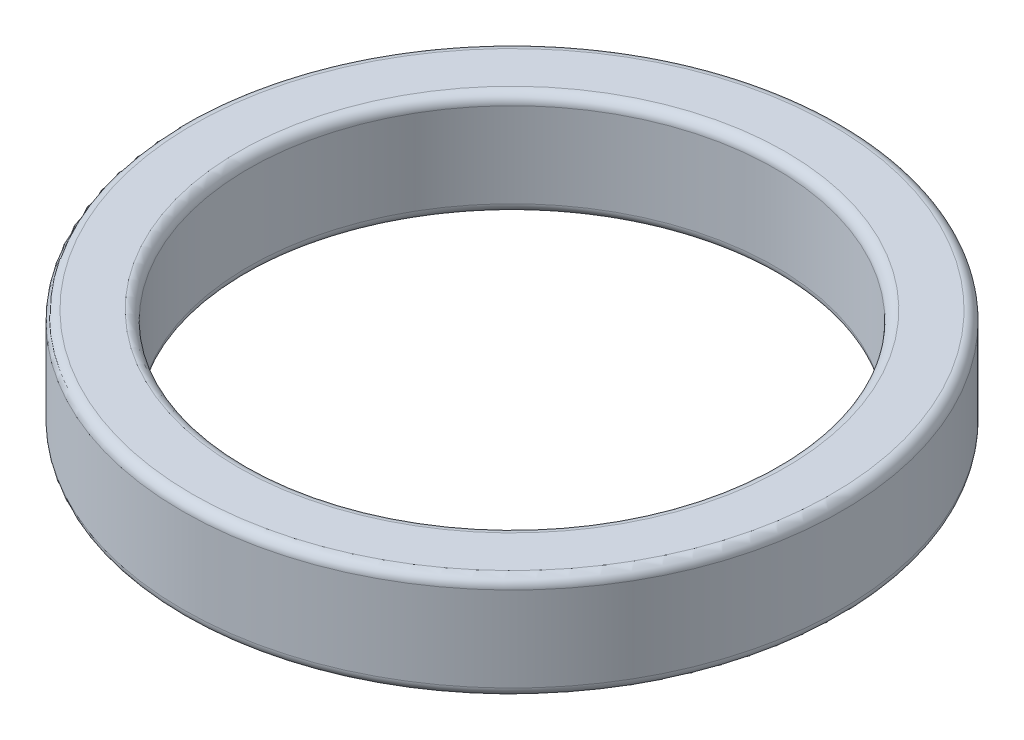
ISO-10303-21;
HEADER;
FILE_DESCRIPTION(('STEP AP214'),'2;1');
FILE_NAME('part.step','',(''),(''),'','','');
FILE_SCHEMA(('AUTOMOTIVE_DESIGN { 1 0 10303 214 1 1 1 1 }'));
ENDSEC;
DATA;
#1=APPLICATION_CONTEXT('core data for automotive mechanical design processes');
#2=APPLICATION_PROTOCOL_DEFINITION('international standard','automotive_design',2000,#1);
#3=PRODUCT_CONTEXT('',#1,'mechanical');
#4=PRODUCT('Part','Part','',(#3));
#5=PRODUCT_RELATED_PRODUCT_CATEGORY('part','',(#4));
#6=PRODUCT_DEFINITION_FORMATION('','',#4);
#7=PRODUCT_DEFINITION_CONTEXT('part definition',#1,'design');
#8=PRODUCT_DEFINITION('design','',#6,#7);
#9=PRODUCT_DEFINITION_SHAPE('','',#8);
#10=(LENGTH_UNIT() NAMED_UNIT(*) SI_UNIT(.MILLI.,.METRE.));
#11=(NAMED_UNIT(*) PLANE_ANGLE_UNIT() SI_UNIT($,.RADIAN.));
#12=(NAMED_UNIT(*) SI_UNIT($,.STERADIAN.) SOLID_ANGLE_UNIT());
#13=UNCERTAINTY_MEASURE_WITH_UNIT(LENGTH_MEASURE(1.E-05),#10,'distance_accuracy_value','');
#14=(GEOMETRIC_REPRESENTATION_CONTEXT(3) GLOBAL_UNCERTAINTY_ASSIGNED_CONTEXT((#13)) GLOBAL_UNIT_ASSIGNED_CONTEXT((#10,
#11,#12)) REPRESENTATION_CONTEXT('',''));
#15=CARTESIAN_POINT('',(0.,0.,0.));
#16=DIRECTION('',(0.,0.,1.));
#17=DIRECTION('',(1.,0.,0.));
#18=AXIS2_PLACEMENT_3D('',#15,#16,#17);
#19=CARTESIAN_POINT('',(0.,1.5875,0.));
#20=DIRECTION('',(0.,1.,0.));
#21=DIRECTION('',(0.,0.,1.));
#22=AXIS2_PLACEMENT_3D('',#19,#20,#21);
#23=PLANE('',#22);
#24=CARTESIAN_POINT('',(0.,1.5875,0.));
#25=DIRECTION('',(0.,1.,0.));
#26=DIRECTION('',(0.,0.,1.));
#27=AXIS2_PLACEMENT_3D('',#24,#25,#26);
#28=CIRCLE('',#27,4.15);
#29=CARTESIAN_POINT('',(0.,1.5875,4.15));
#30=VERTEX_POINT('',#29);
#31=EDGE_CURVE('E10',#30,#30,#28,.F.);
#32=ORIENTED_EDGE('',*,*,#31,.T.);
#33=EDGE_LOOP('',(#32));
#34=FACE_BOUND('',#33,.T.);
#35=CARTESIAN_POINT('',(0.,1.5875,0.));
#36=DIRECTION('',(0.,1.,0.));
#37=DIRECTION('',(0.,0.,1.));
#38=AXIS2_PLACEMENT_3D('',#35,#36,#37);
#39=CIRCLE('',#38,4.85);
#40=CARTESIAN_POINT('',(0.,1.5875,4.85));
#41=VERTEX_POINT('',#40);
#42=EDGE_CURVE('E38',#41,#41,#39,.T.);
#43=ORIENTED_EDGE('',*,*,#42,.T.);
#44=EDGE_LOOP('',(#43));
#45=FACE_BOUND('',#44,.T.);
#46=ADVANCED_FACE('F31',(#34,#45),#23,.T.);
#47=CARTESIAN_POINT('',(0.,0.,0.));
#48=DIRECTION('',(0.,1.,0.));
#49=DIRECTION('',(0.,0.,1.));
#50=AXIS2_PLACEMENT_3D('',#47,#48,#49);
#51=PLANE('',#50);
#52=CARTESIAN_POINT('',(0.,0.,0.));
#53=DIRECTION('',(0.,1.,0.));
#54=DIRECTION('',(0.,0.,1.));
#55=AXIS2_PLACEMENT_3D('',#52,#53,#54);
#56=CIRCLE('',#55,4.15);
#57=CARTESIAN_POINT('',(0.,0.,4.15));
#58=VERTEX_POINT('',#57);
#59=EDGE_CURVE('E57',#58,#58,#56,.T.);
#60=ORIENTED_EDGE('',*,*,#59,.T.);
#61=EDGE_LOOP('',(#60));
#62=FACE_BOUND('',#61,.T.);
#63=CARTESIAN_POINT('',(0.,0.,0.));
#64=DIRECTION('',(0.,1.,0.));
#65=DIRECTION('',(0.,0.,1.));
#66=AXIS2_PLACEMENT_3D('',#63,#64,#65);
#67=CIRCLE('',#66,4.85);
#68=CARTESIAN_POINT('',(0.,0.,4.85));
#69=VERTEX_POINT('',#68);
#70=EDGE_CURVE('E60',#69,#69,#67,.F.);
#71=ORIENTED_EDGE('',*,*,#70,.T.);
#72=EDGE_LOOP('',(#71));
#73=FACE_BOUND('',#72,.T.);
#74=ADVANCED_FACE('F64',(#62,#73),#51,.F.);
#75=CARTESIAN_POINT('',(0.,1.5875,0.));
#76=DIRECTION('',(0.,-1.,0.));
#77=DIRECTION('',(0.,0.,-1.));
#78=AXIS2_PLACEMENT_3D('',#75,#76,#77);
#79=CYLINDRICAL_SURFACE('',#78,5.);
#80=CARTESIAN_POINT('',(0.,0.15,0.));
#81=DIRECTION('',(0.,1.,0.));
#82=DIRECTION('',(0.,0.,1.));
#83=AXIS2_PLACEMENT_3D('',#80,#81,#82);
#84=CIRCLE('',#83,5.);
#85=CARTESIAN_POINT('',(0.,0.15,5.));
#86=VERTEX_POINT('',#85);
#87=EDGE_CURVE('E42',#86,#86,#84,.T.);
#88=ORIENTED_EDGE('',*,*,#87,.T.);
#89=EDGE_LOOP('',(#88));
#90=FACE_BOUND('',#89,.T.);
#91=CARTESIAN_POINT('',(0.,1.4375,0.));
#92=DIRECTION('',(0.,1.,0.));
#93=DIRECTION('',(0.,0.,1.));
#94=AXIS2_PLACEMENT_3D('',#91,#92,#93);
#95=CIRCLE('',#94,5.);
#96=CARTESIAN_POINT('',(0.,1.4375,5.));
#97=VERTEX_POINT('',#96);
#98=EDGE_CURVE('E46',#97,#97,#95,.F.);
#99=ORIENTED_EDGE('',*,*,#98,.T.);
#100=EDGE_LOOP('',(#99));
#101=FACE_BOUND('',#100,.T.);
#102=ADVANCED_FACE('F74',(#90,#101),#79,.T.);
#103=CARTESIAN_POINT('',(0.,1.5875,0.));
#104=DIRECTION('',(0.,-1.,0.));
#105=DIRECTION('',(0.,0.,-1.));
#106=AXIS2_PLACEMENT_3D('',#103,#104,#105);
#107=CYLINDRICAL_SURFACE('',#106,4.);
#108=CARTESIAN_POINT('',(0.,0.15,0.));
#109=DIRECTION('',(0.,1.,0.));
#110=DIRECTION('',(0.,0.,1.));
#111=AXIS2_PLACEMENT_3D('',#108,#109,#110);
#112=CIRCLE('',#111,4.);
#113=CARTESIAN_POINT('',(0.,0.15,4.));
#114=VERTEX_POINT('',#113);
#115=EDGE_CURVE('E51',#114,#114,#112,.F.);
#116=ORIENTED_EDGE('',*,*,#115,.T.);
#117=EDGE_LOOP('',(#116));
#118=FACE_BOUND('',#117,.T.);
#119=CARTESIAN_POINT('',(0.,1.4375,0.));
#120=DIRECTION('',(0.,1.,0.));
#121=DIRECTION('',(0.,0.,1.));
#122=AXIS2_PLACEMENT_3D('',#119,#120,#121);
#123=CIRCLE('',#122,4.);
#124=CARTESIAN_POINT('',(0.,1.4375,4.));
#125=VERTEX_POINT('',#124);
#126=EDGE_CURVE('E54',#125,#125,#123,.T.);
#127=ORIENTED_EDGE('',*,*,#126,.T.);
#128=EDGE_LOOP('',(#127));
#129=FACE_BOUND('',#128,.T.);
#130=ADVANCED_FACE('F77',(#118,#129),#107,.F.);
#131=CARTESIAN_POINT('',(0.,0.15,0.));
#132=DIRECTION('',(0.,1.,0.));
#133=DIRECTION('',(0.,0.,1.));
#134=AXIS2_PLACEMENT_3D('',#131,#132,#133);
#135=TOROIDAL_SURFACE('',#134,4.15,0.15);
#136=ORIENTED_EDGE('',*,*,#115,.F.);
#137=EDGE_LOOP('',(#136));
#138=FACE_BOUND('',#137,.T.);
#139=ORIENTED_EDGE('',*,*,#59,.F.);
#140=EDGE_LOOP('',(#139));
#141=FACE_BOUND('',#140,.T.);
#142=ADVANCED_FACE('F70',(#138,#141),#135,.T.);
#143=CARTESIAN_POINT('',(0.,0.15,0.));
#144=DIRECTION('',(0.,1.,0.));
#145=DIRECTION('',(0.,0.,1.));
#146=AXIS2_PLACEMENT_3D('',#143,#144,#145);
#147=TOROIDAL_SURFACE('',#146,4.85,0.15);
#148=ORIENTED_EDGE('',*,*,#70,.F.);
#149=EDGE_LOOP('',(#148));
#150=FACE_BOUND('',#149,.T.);
#151=ORIENTED_EDGE('',*,*,#87,.F.);
#152=EDGE_LOOP('',(#151));
#153=FACE_BOUND('',#152,.T.);
#154=ADVANCED_FACE('F66',(#150,#153),#147,.T.);
#155=CARTESIAN_POINT('',(0.,1.4375,0.));
#156=DIRECTION('',(0.,1.,0.));
#157=DIRECTION('',(0.,0.,1.));
#158=AXIS2_PLACEMENT_3D('',#155,#156,#157);
#159=TOROIDAL_SURFACE('',#158,4.15,0.15);
#160=ORIENTED_EDGE('',*,*,#31,.F.);
#161=EDGE_LOOP('',(#160));
#162=FACE_BOUND('',#161,.T.);
#163=ORIENTED_EDGE('',*,*,#126,.F.);
#164=EDGE_LOOP('',(#163));
#165=FACE_BOUND('',#164,.T.);
#166=ADVANCED_FACE('F69',(#162,#165),#159,.T.);
#167=CARTESIAN_POINT('',(0.,1.4375,0.));
#168=DIRECTION('',(0.,1.,0.));
#169=DIRECTION('',(0.,0.,1.));
#170=AXIS2_PLACEMENT_3D('',#167,#168,#169);
#171=TOROIDAL_SURFACE('',#170,4.85,0.15);
#172=ORIENTED_EDGE('',*,*,#98,.F.);
#173=EDGE_LOOP('',(#172));
#174=FACE_BOUND('',#173,.T.);
#175=ORIENTED_EDGE('',*,*,#42,.F.);
#176=EDGE_LOOP('',(#175));
#177=FACE_BOUND('',#176,.T.);
#178=ADVANCED_FACE('F33',(#174,#177),#171,.T.);
#179=CLOSED_SHELL('',(#46,#74,#102,#130,#142,#154,#166,#178));
#180=MANIFOLD_SOLID_BREP('B2',#179);
#181=ADVANCED_BREP_SHAPE_REPRESENTATION('',(#18,#180),#14);
#182=SHAPE_DEFINITION_REPRESENTATION(#9,#181);
ENDSEC;
END-ISO-10303-21;
